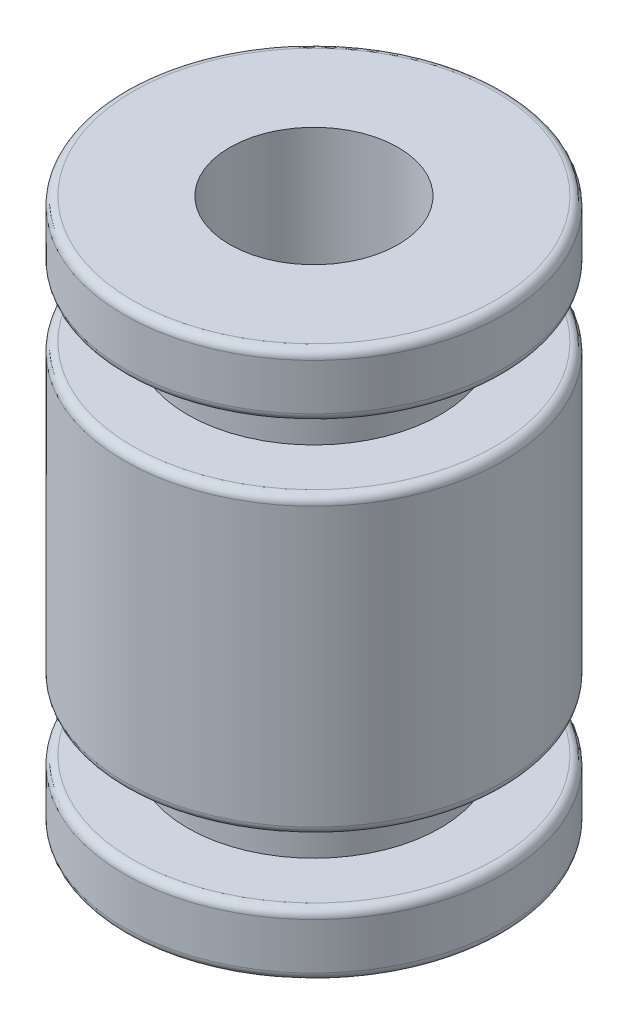
ISO-10303-21;
HEADER;
FILE_DESCRIPTION(('STEP AP214'),'2;1');
FILE_NAME('part.step','',(''),(''),'','','');
FILE_SCHEMA(('AUTOMOTIVE_DESIGN { 1 0 10303 214 1 1 1 1 }'));
ENDSEC;
DATA;
#1=APPLICATION_CONTEXT('core data for automotive mechanical design processes');
#2=APPLICATION_PROTOCOL_DEFINITION('international standard','automotive_design',2000,#1);
#3=PRODUCT_CONTEXT('',#1,'mechanical');
#4=PRODUCT('Part','Part','',(#3));
#5=PRODUCT_RELATED_PRODUCT_CATEGORY('part','',(#4));
#6=PRODUCT_DEFINITION_FORMATION('','',#4);
#7=PRODUCT_DEFINITION_CONTEXT('part definition',#1,'design');
#8=PRODUCT_DEFINITION('design','',#6,#7);
#9=PRODUCT_DEFINITION_SHAPE('','',#8);
#10=(LENGTH_UNIT() NAMED_UNIT(*) SI_UNIT(.MILLI.,.METRE.));
#11=(NAMED_UNIT(*) PLANE_ANGLE_UNIT() SI_UNIT($,.RADIAN.));
#12=(NAMED_UNIT(*) SI_UNIT($,.STERADIAN.) SOLID_ANGLE_UNIT());
#13=UNCERTAINTY_MEASURE_WITH_UNIT(LENGTH_MEASURE(1.E-05),#10,'distance_accuracy_value','');
#14=(GEOMETRIC_REPRESENTATION_CONTEXT(3) GLOBAL_UNCERTAINTY_ASSIGNED_CONTEXT((#13)) GLOBAL_UNIT_ASSIGNED_CONTEXT((#10,
#11,#12)) REPRESENTATION_CONTEXT('',''));
#15=CARTESIAN_POINT('',(0.,0.,0.));
#16=DIRECTION('',(0.,0.,1.));
#17=DIRECTION('',(1.,0.,0.));
#18=AXIS2_PLACEMENT_3D('',#15,#16,#17);
#19=CARTESIAN_POINT('',(0.,10.,0.));
#20=DIRECTION('',(0.,1.,0.));
#21=DIRECTION('',(0.,0.,1.));
#22=AXIS2_PLACEMENT_3D('',#19,#20,#21);
#23=PLANE('',#22);
#24=CARTESIAN_POINT('',(0.,10.,0.));
#25=DIRECTION('',(0.,1.,0.));
#26=DIRECTION('',(0.,0.,1.));
#27=AXIS2_PLACEMENT_3D('',#24,#25,#26);
#28=CIRCLE('',#27,4.3);
#29=CARTESIAN_POINT('',(0.,10.,4.3));
#30=VERTEX_POINT('',#29);
#31=EDGE_CURVE('E52',#30,#30,#28,.T.);
#32=ORIENTED_EDGE('',*,*,#31,.T.);
#33=EDGE_LOOP('',(#32));
#34=FACE_BOUND('',#33,.T.);
#35=CARTESIAN_POINT('',(0.,10.,0.));
#36=DIRECTION('',(0.,1.,0.));
#37=DIRECTION('',(0.,0.,1.));
#38=AXIS2_PLACEMENT_3D('',#35,#36,#37);
#39=CIRCLE('',#38,3.);
#40=CARTESIAN_POINT('',(0.,10.,3.));
#41=VERTEX_POINT('',#40);
#42=EDGE_CURVE('E86',#41,#41,#39,.T.);
#43=ORIENTED_EDGE('',*,*,#42,.F.);
#44=EDGE_LOOP('',(#43));
#45=FACE_BOUND('',#44,.T.);
#46=ADVANCED_FACE('F32',(#34,#45),#23,.T.);
#47=CARTESIAN_POINT('',(0.,1.5,0.));
#48=DIRECTION('',(0.,1.,0.));
#49=DIRECTION('',(0.,0.,1.));
#50=AXIS2_PLACEMENT_3D('',#47,#48,#49);
#51=PLANE('',#50);
#52=CARTESIAN_POINT('',(0.,1.5,0.));
#53=DIRECTION('',(0.,1.,0.));
#54=DIRECTION('',(0.,0.,1.));
#55=AXIS2_PLACEMENT_3D('',#52,#53,#54);
#56=CIRCLE('',#55,4.3);
#57=CARTESIAN_POINT('',(0.,1.5,4.3));
#58=VERTEX_POINT('',#57);
#59=EDGE_CURVE('E64',#58,#58,#56,.T.);
#60=ORIENTED_EDGE('',*,*,#59,.T.);
#61=EDGE_LOOP('',(#60));
#62=FACE_BOUND('',#61,.T.);
#63=CARTESIAN_POINT('',(0.,1.5,0.));
#64=DIRECTION('',(0.,1.,0.));
#65=DIRECTION('',(0.,0.,1.));
#66=AXIS2_PLACEMENT_3D('',#63,#64,#65);
#67=CIRCLE('',#66,3.);
#68=CARTESIAN_POINT('',(0.,1.5,3.));
#69=VERTEX_POINT('',#68);
#70=EDGE_CURVE('E80',#69,#69,#67,.T.);
#71=ORIENTED_EDGE('',*,*,#70,.F.);
#72=EDGE_LOOP('',(#71));
#73=FACE_BOUND('',#72,.T.);
#74=ADVANCED_FACE('F112',(#62,#73),#51,.T.);
#75=CARTESIAN_POINT('',(0.,0.,0.));
#76=DIRECTION('',(0.,1.,0.));
#77=DIRECTION('',(0.,0.,1.));
#78=AXIS2_PLACEMENT_3D('',#75,#76,#77);
#79=PLANE('',#78);
#80=CARTESIAN_POINT('',(0.,0.,0.));
#81=DIRECTION('',(0.,1.,0.));
#82=DIRECTION('',(0.,0.,1.));
#83=AXIS2_PLACEMENT_3D('',#80,#81,#82);
#84=CIRCLE('',#83,4.3);
#85=CARTESIAN_POINT('',(0.,0.,4.3));
#86=VERTEX_POINT('',#85);
#87=EDGE_CURVE('E67',#86,#86,#84,.F.);
#88=ORIENTED_EDGE('',*,*,#87,.T.);
#89=EDGE_LOOP('',(#88));
#90=FACE_BOUND('',#89,.T.);
#91=CARTESIAN_POINT('',(0.,0.,0.));
#92=DIRECTION('',(0.,1.,0.));
#93=DIRECTION('',(0.,0.,1.));
#94=AXIS2_PLACEMENT_3D('',#91,#92,#93);
#95=CIRCLE('',#94,2.);
#96=CARTESIAN_POINT('',(0.,0.,2.));
#97=VERTEX_POINT('',#96);
#98=EDGE_CURVE('E76',#97,#97,#95,.T.);
#99=ORIENTED_EDGE('',*,*,#98,.T.);
#100=EDGE_LOOP('',(#99));
#101=FACE_BOUND('',#100,.T.);
#102=ADVANCED_FACE('F118',(#90,#101),#79,.F.);
#103=CARTESIAN_POINT('',(0.,1.5,0.));
#104=DIRECTION('',(0.,-1.,0.));
#105=DIRECTION('',(0.,0.,-1.));
#106=AXIS2_PLACEMENT_3D('',#103,#104,#105);
#107=CYLINDRICAL_SURFACE('',#106,4.5);
#108=CARTESIAN_POINT('',(0.,0.2,0.));
#109=DIRECTION('',(0.,1.,0.));
#110=DIRECTION('',(0.,0.,1.));
#111=AXIS2_PLACEMENT_3D('',#108,#109,#110);
#112=CIRCLE('',#111,4.5);
#113=CARTESIAN_POINT('',(0.,0.2,4.5));
#114=VERTEX_POINT('',#113);
#115=EDGE_CURVE('E70',#114,#114,#112,.T.);
#116=ORIENTED_EDGE('',*,*,#115,.T.);
#117=EDGE_LOOP('',(#116));
#118=FACE_BOUND('',#117,.T.);
#119=CARTESIAN_POINT('',(0.,1.3,0.));
#120=DIRECTION('',(0.,1.,0.));
#121=DIRECTION('',(0.,0.,1.));
#122=AXIS2_PLACEMENT_3D('',#119,#120,#121);
#123=CIRCLE('',#122,4.5);
#124=CARTESIAN_POINT('',(0.,1.3,4.5));
#125=VERTEX_POINT('',#124);
#126=EDGE_CURVE('E73',#125,#125,#123,.F.);
#127=ORIENTED_EDGE('',*,*,#126,.T.);
#128=EDGE_LOOP('',(#127));
#129=FACE_BOUND('',#128,.T.);
#130=ADVANCED_FACE('F137',(#118,#129),#107,.T.);
#131=CARTESIAN_POINT('',(0.,1.5,0.));
#132=DIRECTION('',(0.,-1.,0.));
#133=DIRECTION('',(0.,0.,-1.));
#134=AXIS2_PLACEMENT_3D('',#131,#132,#133);
#135=CYLINDRICAL_SURFACE('',#134,2.);
#136=ORIENTED_EDGE('',*,*,#98,.F.);
#137=EDGE_LOOP('',(#136));
#138=FACE_BOUND('',#137,.T.);
#139=CARTESIAN_POINT('',(0.,13.,0.));
#140=DIRECTION('',(0.,1.,0.));
#141=DIRECTION('',(0.,0.,1.));
#142=AXIS2_PLACEMENT_3D('',#139,#140,#141);
#143=CIRCLE('',#142,2.);
#144=CARTESIAN_POINT('',(0.,13.,2.));
#145=VERTEX_POINT('',#144);
#146=EDGE_CURVE('E89',#145,#145,#143,.T.);
#147=ORIENTED_EDGE('',*,*,#146,.T.);
#148=EDGE_LOOP('',(#147));
#149=FACE_BOUND('',#148,.T.);
#150=ADVANCED_FACE('F95',(#138,#149),#135,.F.);
#151=CARTESIAN_POINT('',(0.,3.,0.));
#152=DIRECTION('',(0.,-1.,0.));
#153=DIRECTION('',(0.,0.,-1.));
#154=AXIS2_PLACEMENT_3D('',#151,#152,#153);
#155=CYLINDRICAL_SURFACE('',#154,3.);
#156=CARTESIAN_POINT('',(0.,3.,0.));
#157=DIRECTION('',(0.,1.,0.));
#158=DIRECTION('',(0.,0.,1.));
#159=AXIS2_PLACEMENT_3D('',#156,#157,#158);
#160=CIRCLE('',#159,3.);
#161=CARTESIAN_POINT('',(0.,3.,3.));
#162=VERTEX_POINT('',#161);
#163=EDGE_CURVE('E79',#162,#162,#160,.T.);
#164=ORIENTED_EDGE('',*,*,#163,.F.);
#165=EDGE_LOOP('',(#164));
#166=FACE_BOUND('',#165,.T.);
#167=ORIENTED_EDGE('',*,*,#70,.T.);
#168=EDGE_LOOP('',(#167));
#169=FACE_BOUND('',#168,.T.);
#170=ADVANCED_FACE('F128',(#166,#169),#155,.T.);
#171=CARTESIAN_POINT('',(0.,3.,0.));
#172=DIRECTION('',(0.,1.,0.));
#173=DIRECTION('',(0.,0.,1.));
#174=AXIS2_PLACEMENT_3D('',#171,#172,#173);
#175=PLANE('',#174);
#176=CARTESIAN_POINT('',(0.,3.,0.));
#177=DIRECTION('',(0.,1.,0.));
#178=DIRECTION('',(0.,0.,1.));
#179=AXIS2_PLACEMENT_3D('',#176,#177,#178);
#180=CIRCLE('',#179,4.3);
#181=CARTESIAN_POINT('',(0.,3.,4.3));
#182=VERTEX_POINT('',#181);
#183=EDGE_CURVE('E55',#182,#182,#180,.F.);
#184=ORIENTED_EDGE('',*,*,#183,.T.);
#185=EDGE_LOOP('',(#184));
#186=FACE_BOUND('',#185,.T.);
#187=ORIENTED_EDGE('',*,*,#163,.T.);
#188=EDGE_LOOP('',(#187));
#189=FACE_BOUND('',#188,.T.);
#190=ADVANCED_FACE('F124',(#186,#189),#175,.F.);
#191=CARTESIAN_POINT('',(0.,10.,0.));
#192=DIRECTION('',(0.,-1.,0.));
#193=DIRECTION('',(0.,0.,-1.));
#194=AXIS2_PLACEMENT_3D('',#191,#192,#193);
#195=CYLINDRICAL_SURFACE('',#194,4.5);
#196=CARTESIAN_POINT('',(0.,3.2,0.));
#197=DIRECTION('',(0.,1.,0.));
#198=DIRECTION('',(0.,0.,1.));
#199=AXIS2_PLACEMENT_3D('',#196,#197,#198);
#200=CIRCLE('',#199,4.5);
#201=CARTESIAN_POINT('',(0.,3.2,4.5));
#202=VERTEX_POINT('',#201);
#203=EDGE_CURVE('E58',#202,#202,#200,.T.);
#204=ORIENTED_EDGE('',*,*,#203,.T.);
#205=EDGE_LOOP('',(#204));
#206=FACE_BOUND('',#205,.T.);
#207=CARTESIAN_POINT('',(0.,9.8,0.));
#208=DIRECTION('',(0.,1.,0.));
#209=DIRECTION('',(0.,0.,1.));
#210=AXIS2_PLACEMENT_3D('',#207,#208,#209);
#211=CIRCLE('',#210,4.5);
#212=CARTESIAN_POINT('',(0.,9.8,4.5));
#213=VERTEX_POINT('',#212);
#214=EDGE_CURVE('E61',#213,#213,#211,.F.);
#215=ORIENTED_EDGE('',*,*,#214,.T.);
#216=EDGE_LOOP('',(#215));
#217=FACE_BOUND('',#216,.T.);
#218=ADVANCED_FACE('F127',(#206,#217),#195,.T.);
#219=CARTESIAN_POINT('',(0.,11.5,0.));
#220=DIRECTION('',(0.,-1.,0.));
#221=DIRECTION('',(0.,0.,-1.));
#222=AXIS2_PLACEMENT_3D('',#219,#220,#221);
#223=CYLINDRICAL_SURFACE('',#222,3.);
#224=CARTESIAN_POINT('',(0.,11.5,0.));
#225=DIRECTION('',(0.,1.,0.));
#226=DIRECTION('',(0.,0.,1.));
#227=AXIS2_PLACEMENT_3D('',#224,#225,#226);
#228=CIRCLE('',#227,3.);
#229=CARTESIAN_POINT('',(0.,11.5,3.));
#230=VERTEX_POINT('',#229);
#231=EDGE_CURVE('E83',#230,#230,#228,.T.);
#232=ORIENTED_EDGE('',*,*,#231,.F.);
#233=EDGE_LOOP('',(#232));
#234=FACE_BOUND('',#233,.T.);
#235=ORIENTED_EDGE('',*,*,#42,.T.);
#236=EDGE_LOOP('',(#235));
#237=FACE_BOUND('',#236,.T.);
#238=ADVANCED_FACE('F109',(#234,#237),#223,.T.);
#239=CARTESIAN_POINT('',(0.,11.5,0.));
#240=DIRECTION('',(0.,1.,0.));
#241=DIRECTION('',(0.,0.,1.));
#242=AXIS2_PLACEMENT_3D('',#239,#240,#241);
#243=PLANE('',#242);
#244=CARTESIAN_POINT('',(0.,11.5,0.));
#245=DIRECTION('',(0.,1.,0.));
#246=DIRECTION('',(0.,0.,1.));
#247=AXIS2_PLACEMENT_3D('',#244,#245,#246);
#248=CIRCLE('',#247,4.3);
#249=CARTESIAN_POINT('',(0.,11.5,4.3));
#250=VERTEX_POINT('',#249);
#251=EDGE_CURVE('E39',#250,#250,#248,.F.);
#252=ORIENTED_EDGE('',*,*,#251,.T.);
#253=EDGE_LOOP('',(#252));
#254=FACE_BOUND('',#253,.T.);
#255=ORIENTED_EDGE('',*,*,#231,.T.);
#256=EDGE_LOOP('',(#255));
#257=FACE_BOUND('',#256,.T.);
#258=ADVANCED_FACE('F100',(#254,#257),#243,.F.);
#259=CARTESIAN_POINT('',(0.,13.,0.));
#260=DIRECTION('',(0.,1.,0.));
#261=DIRECTION('',(0.,0.,1.));
#262=AXIS2_PLACEMENT_3D('',#259,#260,#261);
#263=PLANE('',#262);
#264=CARTESIAN_POINT('',(0.,13.,0.));
#265=DIRECTION('',(0.,1.,0.));
#266=DIRECTION('',(0.,0.,1.));
#267=AXIS2_PLACEMENT_3D('',#264,#265,#266);
#268=CIRCLE('',#267,4.3);
#269=CARTESIAN_POINT('',(0.,13.,4.3));
#270=VERTEX_POINT('',#269);
#271=EDGE_CURVE('E10',#270,#270,#268,.T.);
#272=ORIENTED_EDGE('',*,*,#271,.T.);
#273=EDGE_LOOP('',(#272));
#274=FACE_BOUND('',#273,.T.);
#275=ORIENTED_EDGE('',*,*,#146,.F.);
#276=EDGE_LOOP('',(#275));
#277=FACE_BOUND('',#276,.T.);
#278=ADVANCED_FACE('F97',(#274,#277),#263,.T.);
#279=CARTESIAN_POINT('',(0.,13.,0.));
#280=DIRECTION('',(0.,-1.,0.));
#281=DIRECTION('',(0.,0.,-1.));
#282=AXIS2_PLACEMENT_3D('',#279,#280,#281);
#283=CYLINDRICAL_SURFACE('',#282,4.5);
#284=CARTESIAN_POINT('',(0.,11.7,0.));
#285=DIRECTION('',(0.,1.,0.));
#286=DIRECTION('',(0.,0.,1.));
#287=AXIS2_PLACEMENT_3D('',#284,#285,#286);
#288=CIRCLE('',#287,4.5);
#289=CARTESIAN_POINT('',(0.,11.7,4.5));
#290=VERTEX_POINT('',#289);
#291=EDGE_CURVE('E43',#290,#290,#288,.T.);
#292=ORIENTED_EDGE('',*,*,#291,.T.);
#293=EDGE_LOOP('',(#292));
#294=FACE_BOUND('',#293,.T.);
#295=CARTESIAN_POINT('',(0.,12.8,0.));
#296=DIRECTION('',(0.,1.,0.));
#297=DIRECTION('',(0.,0.,1.));
#298=AXIS2_PLACEMENT_3D('',#295,#296,#297);
#299=CIRCLE('',#298,4.5);
#300=CARTESIAN_POINT('',(0.,12.8,4.5));
#301=VERTEX_POINT('',#300);
#302=EDGE_CURVE('E47',#301,#301,#299,.F.);
#303=ORIENTED_EDGE('',*,*,#302,.T.);
#304=EDGE_LOOP('',(#303));
#305=FACE_BOUND('',#304,.T.);
#306=ADVANCED_FACE('F99',(#294,#305),#283,.T.);
#307=CARTESIAN_POINT('',(0.,0.2,0.));
#308=DIRECTION('',(0.,1.,0.));
#309=DIRECTION('',(0.,0.,1.));
#310=AXIS2_PLACEMENT_3D('',#307,#308,#309);
#311=TOROIDAL_SURFACE('',#310,4.3,0.2);
#312=ORIENTED_EDGE('',*,*,#87,.F.);
#313=EDGE_LOOP('',(#312));
#314=FACE_BOUND('',#313,.T.);
#315=ORIENTED_EDGE('',*,*,#115,.F.);
#316=EDGE_LOOP('',(#315));
#317=FACE_BOUND('',#316,.T.);
#318=ADVANCED_FACE('F106',(#314,#317),#311,.T.);
#319=CARTESIAN_POINT('',(0.,1.3,0.));
#320=DIRECTION('',(0.,1.,0.));
#321=DIRECTION('',(0.,0.,1.));
#322=AXIS2_PLACEMENT_3D('',#319,#320,#321);
#323=TOROIDAL_SURFACE('',#322,4.3,0.2);
#324=ORIENTED_EDGE('',*,*,#126,.F.);
#325=EDGE_LOOP('',(#324));
#326=FACE_BOUND('',#325,.T.);
#327=ORIENTED_EDGE('',*,*,#59,.F.);
#328=EDGE_LOOP('',(#327));
#329=FACE_BOUND('',#328,.T.);
#330=ADVANCED_FACE('F148',(#326,#329),#323,.T.);
#331=CARTESIAN_POINT('',(0.,3.2,0.));
#332=DIRECTION('',(0.,1.,0.));
#333=DIRECTION('',(0.,0.,1.));
#334=AXIS2_PLACEMENT_3D('',#331,#332,#333);
#335=TOROIDAL_SURFACE('',#334,4.3,0.2);
#336=ORIENTED_EDGE('',*,*,#183,.F.);
#337=EDGE_LOOP('',(#336));
#338=FACE_BOUND('',#337,.T.);
#339=ORIENTED_EDGE('',*,*,#203,.F.);
#340=EDGE_LOOP('',(#339));
#341=FACE_BOUND('',#340,.T.);
#342=ADVANCED_FACE('F152',(#338,#341),#335,.T.);
#343=CARTESIAN_POINT('',(0.,9.8,0.));
#344=DIRECTION('',(0.,1.,0.));
#345=DIRECTION('',(0.,0.,1.));
#346=AXIS2_PLACEMENT_3D('',#343,#344,#345);
#347=TOROIDAL_SURFACE('',#346,4.3,0.2);
#348=ORIENTED_EDGE('',*,*,#214,.F.);
#349=EDGE_LOOP('',(#348));
#350=FACE_BOUND('',#349,.T.);
#351=ORIENTED_EDGE('',*,*,#31,.F.);
#352=EDGE_LOOP('',(#351));
#353=FACE_BOUND('',#352,.T.);
#354=ADVANCED_FACE('F156',(#350,#353),#347,.T.);
#355=CARTESIAN_POINT('',(0.,11.7,0.));
#356=DIRECTION('',(0.,1.,0.));
#357=DIRECTION('',(0.,0.,1.));
#358=AXIS2_PLACEMENT_3D('',#355,#356,#357);
#359=TOROIDAL_SURFACE('',#358,4.3,0.2);
#360=ORIENTED_EDGE('',*,*,#251,.F.);
#361=EDGE_LOOP('',(#360));
#362=FACE_BOUND('',#361,.T.);
#363=ORIENTED_EDGE('',*,*,#291,.F.);
#364=EDGE_LOOP('',(#363));
#365=FACE_BOUND('',#364,.T.);
#366=ADVANCED_FACE('F159',(#362,#365),#359,.T.);
#367=CARTESIAN_POINT('',(0.,12.8,0.));
#368=DIRECTION('',(0.,1.,0.));
#369=DIRECTION('',(0.,0.,1.));
#370=AXIS2_PLACEMENT_3D('',#367,#368,#369);
#371=TOROIDAL_SURFACE('',#370,4.3,0.2);
#372=ORIENTED_EDGE('',*,*,#302,.F.);
#373=EDGE_LOOP('',(#372));
#374=FACE_BOUND('',#373,.T.);
#375=ORIENTED_EDGE('',*,*,#271,.F.);
#376=EDGE_LOOP('',(#375));
#377=FACE_BOUND('',#376,.T.);
#378=ADVANCED_FACE('F34',(#374,#377),#371,.T.);
#379=CLOSED_SHELL('',(#46,#74,#102,#130,#150,#170,#190,#218,#238,#258,#278,#306,#318,#330,#342,
#354,#366,#378));
#380=MANIFOLD_SOLID_BREP('B2',#379);
#381=ADVANCED_BREP_SHAPE_REPRESENTATION('',(#18,#380),#14);
#382=SHAPE_DEFINITION_REPRESENTATION(#9,#381);
ENDSEC;
END-ISO-10303-21;
